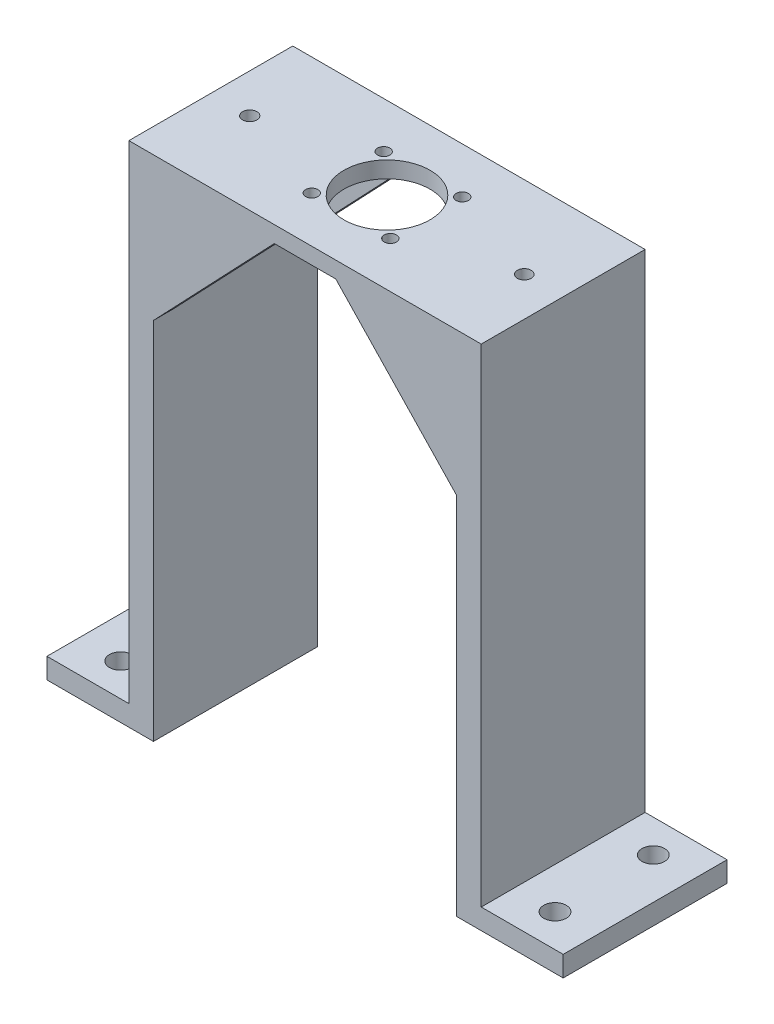
ISO-10303-21;
HEADER;
FILE_DESCRIPTION(('STEP AP214'),'2;1');
FILE_NAME('part.step','',(''),(''),'','','');
FILE_SCHEMA(('AUTOMOTIVE_DESIGN { 1 0 10303 214 1 1 1 1 }'));
ENDSEC;
DATA;
#1=APPLICATION_CONTEXT('core data for automotive mechanical design processes');
#2=APPLICATION_PROTOCOL_DEFINITION('international standard','automotive_design',2000,#1);
#3=PRODUCT_CONTEXT('',#1,'mechanical');
#4=PRODUCT('Part','Part','',(#3));
#5=PRODUCT_RELATED_PRODUCT_CATEGORY('part','',(#4));
#6=PRODUCT_DEFINITION_FORMATION('','',#4);
#7=PRODUCT_DEFINITION_CONTEXT('part definition',#1,'design');
#8=PRODUCT_DEFINITION('design','',#6,#7);
#9=PRODUCT_DEFINITION_SHAPE('','',#8);
#10=(LENGTH_UNIT() NAMED_UNIT(*) SI_UNIT(.MILLI.,.METRE.));
#11=(NAMED_UNIT(*) PLANE_ANGLE_UNIT() SI_UNIT($,.RADIAN.));
#12=(NAMED_UNIT(*) SI_UNIT($,.STERADIAN.) SOLID_ANGLE_UNIT());
#13=UNCERTAINTY_MEASURE_WITH_UNIT(LENGTH_MEASURE(1.E-05),#10,'distance_accuracy_value','');
#14=(GEOMETRIC_REPRESENTATION_CONTEXT(3) GLOBAL_UNCERTAINTY_ASSIGNED_CONTEXT((#13)) GLOBAL_UNIT_ASSIGNED_CONTEXT((#10,
#11,#12)) REPRESENTATION_CONTEXT('',''));
#15=CARTESIAN_POINT('',(0.,0.,0.));
#16=DIRECTION('',(0.,0.,1.));
#17=DIRECTION('',(1.,0.,0.));
#18=AXIS2_PLACEMENT_3D('',#15,#16,#17);
#19=CARTESIAN_POINT('',(0.,4.,0.));
#20=DIRECTION('',(0.,0.,-1.));
#21=DIRECTION('',(-1.,0.,0.));
#22=AXIS2_PLACEMENT_3D('',#19,#20,#21);
#23=PLANE('',#22);
#24=DIRECTION('',(0.689363360647643,-0.724415734917863,0.));
#25=VECTOR('',#24,1.);
#26=CARTESIAN_POINT('',(50.5,0.,0.));
#27=LINE('',#26,#25);
#28=CARTESIAN_POINT('',(50.5,0.,0.));
#29=VERTEX_POINT('',#28);
#30=CARTESIAN_POINT('',(80.,-31.,0.));
#31=VERTEX_POINT('',#30);
#32=EDGE_CURVE('E194',#29,#31,#27,.T.);
#33=ORIENTED_EDGE('',*,*,#32,.T.);
#34=DIRECTION('',(0.,1.,0.));
#35=VECTOR('',#34,1.);
#36=CARTESIAN_POINT('',(80.,-120.,0.));
#37=LINE('',#36,#35);
#38=CARTESIAN_POINT('',(80.,-120.,0.));
#39=VERTEX_POINT('',#38);
#40=EDGE_CURVE('E342',#39,#31,#37,.T.);
#41=ORIENTED_EDGE('',*,*,#40,.F.);
#42=DIRECTION('',(-1.,0.,0.));
#43=VECTOR('',#42,1.);
#44=CARTESIAN_POINT('',(86.,-120.,0.));
#45=LINE('',#44,#43);
#46=CARTESIAN_POINT('',(106.,-120.,0.));
#47=VERTEX_POINT('',#46);
#48=EDGE_CURVE('E335',#47,#39,#45,.T.);
#49=ORIENTED_EDGE('',*,*,#48,.F.);
#50=DIRECTION('',(0.,-1.,0.));
#51=VECTOR('',#50,1.);
#52=CARTESIAN_POINT('',(106.,-120.,0.));
#53=LINE('',#52,#51);
#54=CARTESIAN_POINT('',(106.,-115.,0.));
#55=VERTEX_POINT('',#54);
#56=EDGE_CURVE('E301',#55,#47,#53,.T.);
#57=ORIENTED_EDGE('',*,*,#56,.F.);
#58=DIRECTION('',(-1.,0.,0.));
#59=VECTOR('',#58,1.);
#60=CARTESIAN_POINT('',(106.,-115.,0.));
#61=LINE('',#60,#59);
#62=CARTESIAN_POINT('',(86.,-115.,0.));
#63=VERTEX_POINT('',#62);
#64=EDGE_CURVE('E311',#55,#63,#61,.T.);
#65=ORIENTED_EDGE('',*,*,#64,.T.);
#66=DIRECTION('',(0.,-1.,0.));
#67=VECTOR('',#66,1.);
#68=CARTESIAN_POINT('',(86.,4.,0.));
#69=LINE('',#68,#67);
#70=CARTESIAN_POINT('',(86.,4.,0.));
#71=VERTEX_POINT('',#70);
#72=EDGE_CURVE('E217',#71,#63,#69,.T.);
#73=ORIENTED_EDGE('',*,*,#72,.F.);
#74=DIRECTION('',(1.,0.,0.));
#75=VECTOR('',#74,1.);
#76=CARTESIAN_POINT('',(0.,4.,0.));
#77=LINE('',#76,#75);
#78=CARTESIAN_POINT('',(0.,4.,0.));
#79=VERTEX_POINT('',#78);
#80=EDGE_CURVE('E205',#79,#71,#77,.T.);
#81=ORIENTED_EDGE('',*,*,#80,.F.);
#82=DIRECTION('',(0.,-1.,0.));
#83=VECTOR('',#82,1.);
#84=CARTESIAN_POINT('',(0.,4.,0.));
#85=LINE('',#84,#83);
#86=CARTESIAN_POINT('',(0.,-115.,0.));
#87=VERTEX_POINT('',#86);
#88=EDGE_CURVE('E219',#79,#87,#85,.T.);
#89=ORIENTED_EDGE('',*,*,#88,.T.);
#90=DIRECTION('',(1.,0.,0.));
#91=VECTOR('',#90,1.);
#92=CARTESIAN_POINT('',(-20.,-115.,0.));
#93=LINE('',#92,#91);
#94=CARTESIAN_POINT('',(-20.,-115.,0.));
#95=VERTEX_POINT('',#94);
#96=EDGE_CURVE('E332',#95,#87,#93,.T.);
#97=ORIENTED_EDGE('',*,*,#96,.F.);
#98=DIRECTION('',(0.,1.,0.));
#99=VECTOR('',#98,1.);
#100=CARTESIAN_POINT('',(-20.,-120.,0.));
#101=LINE('',#100,#99);
#102=CARTESIAN_POINT('',(-20.,-120.,0.));
#103=VERTEX_POINT('',#102);
#104=EDGE_CURVE('E324',#103,#95,#101,.T.);
#105=ORIENTED_EDGE('',*,*,#104,.F.);
#106=DIRECTION('',(-1.,0.,0.));
#107=VECTOR('',#106,1.);
#108=CARTESIAN_POINT('',(0.,-120.,0.));
#109=LINE('',#108,#107);
#110=CARTESIAN_POINT('',(5.99999999999999,-120.,0.));
#111=VERTEX_POINT('',#110);
#112=EDGE_CURVE('E349',#111,#103,#109,.T.);
#113=ORIENTED_EDGE('',*,*,#112,.F.);
#114=DIRECTION('',(0.,1.,0.));
#115=VECTOR('',#114,1.);
#116=CARTESIAN_POINT('',(5.99999999999999,-120.,0.));
#117=LINE('',#116,#115);
#118=CARTESIAN_POINT('',(5.99999999999999,-31.,0.));
#119=VERTEX_POINT('',#118);
#120=EDGE_CURVE('E351',#111,#119,#117,.T.);
#121=ORIENTED_EDGE('',*,*,#120,.T.);
#122=DIRECTION('',(0.689363360647643,0.724415734917863,0.));
#123=VECTOR('',#122,1.);
#124=CARTESIAN_POINT('',(5.99999999999999,-31.,0.));
#125=LINE('',#124,#123);
#126=CARTESIAN_POINT('',(35.5,0.,0.));
#127=VERTEX_POINT('',#126);
#128=EDGE_CURVE('E400',#119,#127,#125,.T.);
#129=ORIENTED_EDGE('',*,*,#128,.T.);
#130=DIRECTION('',(1.,0.,0.));
#131=VECTOR('',#130,1.);
#132=CARTESIAN_POINT('',(0.,0.,0.));
#133=LINE('',#132,#131);
#134=EDGE_CURVE('E202',#127,#29,#133,.T.);
#135=ORIENTED_EDGE('',*,*,#134,.T.);
#136=EDGE_LOOP('',(#33,#41,#49,#57,#65,#73,#81,#89,#97,#105,#113,#121,#129,#135));
#137=FACE_BOUND('',#136,.T.);
#138=ADVANCED_FACE('F34',(#137),#23,.F.);
#139=CARTESIAN_POINT('',(0.,4.,-40.));
#140=DIRECTION('',(0.,0.,1.));
#141=DIRECTION('',(1.,0.,0.));
#142=AXIS2_PLACEMENT_3D('',#139,#140,#141);
#143=PLANE('',#142);
#144=DIRECTION('',(0.689363360647643,-0.724415734917863,0.));
#145=VECTOR('',#144,1.);
#146=CARTESIAN_POINT('',(50.5,0.,-40.));
#147=LINE('',#146,#145);
#148=CARTESIAN_POINT('',(50.5,0.,-40.));
#149=VERTEX_POINT('',#148);
#150=CARTESIAN_POINT('',(80.,-31.,-40.));
#151=VERTEX_POINT('',#150);
#152=EDGE_CURVE('E174',#149,#151,#147,.T.);
#153=ORIENTED_EDGE('',*,*,#152,.F.);
#154=DIRECTION('',(-1.,0.,0.));
#155=VECTOR('',#154,1.);
#156=CARTESIAN_POINT('',(0.,0.,-40.));
#157=LINE('',#156,#155);
#158=CARTESIAN_POINT('',(35.5,0.,-40.));
#159=VERTEX_POINT('',#158);
#160=EDGE_CURVE('E188',#149,#159,#157,.T.);
#161=ORIENTED_EDGE('',*,*,#160,.T.);
#162=DIRECTION('',(0.689363360647643,0.724415734917863,0.));
#163=VECTOR('',#162,1.);
#164=CARTESIAN_POINT('',(5.99999999999999,-31.,-40.));
#165=LINE('',#164,#163);
#166=CARTESIAN_POINT('',(5.99999999999999,-31.,-40.));
#167=VERTEX_POINT('',#166);
#168=EDGE_CURVE('E511',#167,#159,#165,.T.);
#169=ORIENTED_EDGE('',*,*,#168,.F.);
#170=DIRECTION('',(0.,1.,0.));
#171=VECTOR('',#170,1.);
#172=CARTESIAN_POINT('',(6.,-120.,-40.));
#173=LINE('',#172,#171);
#174=CARTESIAN_POINT('',(6.,-120.,-40.));
#175=VERTEX_POINT('',#174);
#176=EDGE_CURVE('E354',#175,#167,#173,.T.);
#177=ORIENTED_EDGE('',*,*,#176,.F.);
#178=DIRECTION('',(1.,0.,0.));
#179=VECTOR('',#178,1.);
#180=CARTESIAN_POINT('',(0.,-120.,-40.));
#181=LINE('',#180,#179);
#182=CARTESIAN_POINT('',(-20.,-120.,-40.));
#183=VERTEX_POINT('',#182);
#184=EDGE_CURVE('E345',#183,#175,#181,.T.);
#185=ORIENTED_EDGE('',*,*,#184,.F.);
#186=DIRECTION('',(0.,-1.,0.));
#187=VECTOR('',#186,1.);
#188=CARTESIAN_POINT('',(-20.,-120.,-40.));
#189=LINE('',#188,#187);
#190=CARTESIAN_POINT('',(-20.,-115.,-40.));
#191=VERTEX_POINT('',#190);
#192=EDGE_CURVE('E318',#191,#183,#189,.T.);
#193=ORIENTED_EDGE('',*,*,#192,.F.);
#194=DIRECTION('',(1.,0.,0.));
#195=VECTOR('',#194,1.);
#196=CARTESIAN_POINT('',(-20.,-115.,-40.));
#197=LINE('',#196,#195);
#198=CARTESIAN_POINT('',(0.,-115.,-40.));
#199=VERTEX_POINT('',#198);
#200=EDGE_CURVE('E328',#191,#199,#197,.T.);
#201=ORIENTED_EDGE('',*,*,#200,.T.);
#202=DIRECTION('',(0.,-1.,0.));
#203=VECTOR('',#202,1.);
#204=CARTESIAN_POINT('',(0.,4.,-40.));
#205=LINE('',#204,#203);
#206=CARTESIAN_POINT('',(0.,4.,-40.));
#207=VERTEX_POINT('',#206);
#208=EDGE_CURVE('E212',#207,#199,#205,.T.);
#209=ORIENTED_EDGE('',*,*,#208,.F.);
#210=DIRECTION('',(-1.,0.,0.));
#211=VECTOR('',#210,1.);
#212=CARTESIAN_POINT('',(0.,4.,-40.));
#213=LINE('',#212,#211);
#214=CARTESIAN_POINT('',(86.,4.,-40.));
#215=VERTEX_POINT('',#214);
#216=EDGE_CURVE('E215',#215,#207,#213,.T.);
#217=ORIENTED_EDGE('',*,*,#216,.F.);
#218=DIRECTION('',(0.,-1.,0.));
#219=VECTOR('',#218,1.);
#220=CARTESIAN_POINT('',(86.,4.,-40.));
#221=LINE('',#220,#219);
#222=CARTESIAN_POINT('',(86.,-115.,-40.));
#223=VERTEX_POINT('',#222);
#224=EDGE_CURVE('E214',#215,#223,#221,.T.);
#225=ORIENTED_EDGE('',*,*,#224,.T.);
#226=DIRECTION('',(-1.,0.,0.));
#227=VECTOR('',#226,1.);
#228=CARTESIAN_POINT('',(106.,-115.,-40.));
#229=LINE('',#228,#227);
#230=CARTESIAN_POINT('',(106.,-115.,-40.));
#231=VERTEX_POINT('',#230);
#232=EDGE_CURVE('E315',#231,#223,#229,.T.);
#233=ORIENTED_EDGE('',*,*,#232,.F.);
#234=DIRECTION('',(0.,1.,0.));
#235=VECTOR('',#234,1.);
#236=CARTESIAN_POINT('',(106.,-120.,-40.));
#237=LINE('',#236,#235);
#238=CARTESIAN_POINT('',(106.,-120.,-40.));
#239=VERTEX_POINT('',#238);
#240=EDGE_CURVE('E307',#239,#231,#237,.T.);
#241=ORIENTED_EDGE('',*,*,#240,.F.);
#242=DIRECTION('',(1.,0.,0.));
#243=VECTOR('',#242,1.);
#244=CARTESIAN_POINT('',(86.,-120.,-40.));
#245=LINE('',#244,#243);
#246=CARTESIAN_POINT('',(80.,-120.,-40.));
#247=VERTEX_POINT('',#246);
#248=EDGE_CURVE('E339',#247,#239,#245,.T.);
#249=ORIENTED_EDGE('',*,*,#248,.F.);
#250=DIRECTION('',(0.,1.,0.));
#251=VECTOR('',#250,1.);
#252=CARTESIAN_POINT('',(80.,-120.,-40.));
#253=LINE('',#252,#251);
#254=EDGE_CURVE('E192',#247,#151,#253,.T.);
#255=ORIENTED_EDGE('',*,*,#254,.T.);
#256=EDGE_LOOP('',(#153,#161,#169,#177,#185,#193,#201,#209,#217,#225,#233,#241,#249,#255));
#257=FACE_BOUND('',#256,.T.);
#258=ADVANCED_FACE('F186',(#257),#143,.F.);
#259=CARTESIAN_POINT('',(5.99999999999999,0.,-5.));
#260=DIRECTION('',(0.,0.,1.));
#261=DIRECTION('',(0.,-1.,0.));
#262=AXIS2_PLACEMENT_3D('',#259,#260,#261);
#263=PLANE('',#262);
#264=DIRECTION('',(0.689363360647643,0.724415734917863,0.));
#265=VECTOR('',#264,1.);
#266=CARTESIAN_POINT('',(21.4809556313993,-14.7318771331058,-5.));
#267=LINE('',#266,#265);
#268=CARTESIAN_POINT('',(5.99999999999999,-31.,-5.00000000000001));
#269=VERTEX_POINT('',#268);
#270=CARTESIAN_POINT('',(35.5,0.,-5.));
#271=VERTEX_POINT('',#270);
#272=EDGE_CURVE('E399',#269,#271,#267,.T.);
#273=ORIENTED_EDGE('',*,*,#272,.F.);
#274=DIRECTION('',(0.,-1.,0.));
#275=VECTOR('',#274,1.);
#276=CARTESIAN_POINT('',(5.99999999999999,0.,-5.));
#277=LINE('',#276,#275);
#278=CARTESIAN_POINT('',(5.99999999999999,0.,-5.));
#279=VERTEX_POINT('',#278);
#280=EDGE_CURVE('E233',#279,#269,#277,.T.);
#281=ORIENTED_EDGE('',*,*,#280,.F.);
#282=DIRECTION('',(1.,0.,0.));
#283=VECTOR('',#282,1.);
#284=CARTESIAN_POINT('',(5.99999999999999,0.,-5.));
#285=LINE('',#284,#283);
#286=EDGE_CURVE('E225',#279,#271,#285,.T.);
#287=ORIENTED_EDGE('',*,*,#286,.T.);
#288=EDGE_LOOP('',(#273,#281,#287));
#289=FACE_BOUND('',#288,.T.);
#290=ADVANCED_FACE('F402',(#289),#263,.F.);
#291=CARTESIAN_POINT('',(6.,0.,-35.));
#292=DIRECTION('',(0.,0.,-1.));
#293=DIRECTION('',(0.,1.,0.));
#294=AXIS2_PLACEMENT_3D('',#291,#292,#293);
#295=PLANE('',#294);
#296=DIRECTION('',(-0.689363360647643,-0.724415734917863,0.));
#297=VECTOR('',#296,1.);
#298=CARTESIAN_POINT('',(21.4809556313993,-14.7318771331058,-35.));
#299=LINE('',#298,#297);
#300=CARTESIAN_POINT('',(35.5,0.,-35.));
#301=VERTEX_POINT('',#300);
#302=CARTESIAN_POINT('',(5.99999999999999,-31.,-35.));
#303=VERTEX_POINT('',#302);
#304=EDGE_CURVE('E11',#301,#303,#299,.T.);
#305=ORIENTED_EDGE('',*,*,#304,.F.);
#306=DIRECTION('',(1.,0.,0.));
#307=VECTOR('',#306,1.);
#308=CARTESIAN_POINT('',(6.,0.,-35.));
#309=LINE('',#308,#307);
#310=CARTESIAN_POINT('',(6.,0.,-35.));
#311=VERTEX_POINT('',#310);
#312=EDGE_CURVE('E252',#311,#301,#309,.T.);
#313=ORIENTED_EDGE('',*,*,#312,.F.);
#314=DIRECTION('',(0.,1.,0.));
#315=VECTOR('',#314,1.);
#316=CARTESIAN_POINT('',(6.,0.,-35.));
#317=LINE('',#316,#315);
#318=EDGE_CURVE('E246',#303,#311,#317,.T.);
#319=ORIENTED_EDGE('',*,*,#318,.F.);
#320=EDGE_LOOP('',(#305,#313,#319));
#321=FACE_BOUND('',#320,.T.);
#322=ADVANCED_FACE('F425',(#321),#295,.F.);
#323=CARTESIAN_POINT('',(80.,-31.,-5.));
#324=DIRECTION('',(0.,0.,1.));
#325=DIRECTION('',(0.,-1.,0.));
#326=AXIS2_PLACEMENT_3D('',#323,#324,#325);
#327=PLANE('',#326);
#328=DIRECTION('',(0.689363360647643,-0.724415734917863,0.));
#329=VECTOR('',#328,1.);
#330=CARTESIAN_POINT('',(80.,-31.,-5.));
#331=LINE('',#330,#329);
#332=CARTESIAN_POINT('',(50.5,0.,-5.));
#333=VERTEX_POINT('',#332);
#334=CARTESIAN_POINT('',(80.,-31.,-5.));
#335=VERTEX_POINT('',#334);
#336=EDGE_CURVE('E193',#333,#335,#331,.T.);
#337=ORIENTED_EDGE('',*,*,#336,.F.);
#338=DIRECTION('',(-1.,0.,0.));
#339=VECTOR('',#338,1.);
#340=CARTESIAN_POINT('',(80.,0.,-5.));
#341=LINE('',#340,#339);
#342=CARTESIAN_POINT('',(80.,0.,-5.));
#343=VERTEX_POINT('',#342);
#344=EDGE_CURVE('E235',#343,#333,#341,.T.);
#345=ORIENTED_EDGE('',*,*,#344,.F.);
#346=DIRECTION('',(0.,1.,0.));
#347=VECTOR('',#346,1.);
#348=CARTESIAN_POINT('',(80.,-31.,-5.));
#349=LINE('',#348,#347);
#350=EDGE_CURVE('E404',#335,#343,#349,.T.);
#351=ORIENTED_EDGE('',*,*,#350,.F.);
#352=EDGE_LOOP('',(#337,#345,#351));
#353=FACE_BOUND('',#352,.T.);
#354=ADVANCED_FACE('F418',(#353),#327,.F.);
#355=CARTESIAN_POINT('',(80.,-31.,-35.));
#356=DIRECTION('',(0.,0.,-1.));
#357=DIRECTION('',(-1.,0.,0.));
#358=AXIS2_PLACEMENT_3D('',#355,#356,#357);
#359=PLANE('',#358);
#360=DIRECTION('',(-0.689363360647643,0.724415734917863,0.));
#361=VECTOR('',#360,1.);
#362=CARTESIAN_POINT('',(80.,-31.,-35.));
#363=LINE('',#362,#361);
#364=CARTESIAN_POINT('',(80.,-31.,-35.));
#365=VERTEX_POINT('',#364);
#366=CARTESIAN_POINT('',(50.5,0.,-35.));
#367=VERTEX_POINT('',#366);
#368=EDGE_CURVE('E42',#365,#367,#363,.T.);
#369=ORIENTED_EDGE('',*,*,#368,.F.);
#370=DIRECTION('',(0.,-1.,0.));
#371=VECTOR('',#370,1.);
#372=CARTESIAN_POINT('',(80.,-31.,-35.));
#373=LINE('',#372,#371);
#374=CARTESIAN_POINT('',(80.,0.,-35.));
#375=VERTEX_POINT('',#374);
#376=EDGE_CURVE('E239',#375,#365,#373,.T.);
#377=ORIENTED_EDGE('',*,*,#376,.F.);
#378=DIRECTION('',(-1.,0.,0.));
#379=VECTOR('',#378,1.);
#380=CARTESIAN_POINT('',(80.,0.,-35.));
#381=LINE('',#380,#379);
#382=EDGE_CURVE('E229',#375,#367,#381,.T.);
#383=ORIENTED_EDGE('',*,*,#382,.T.);
#384=EDGE_LOOP('',(#369,#377,#383));
#385=FACE_BOUND('',#384,.T.);
#386=ADVANCED_FACE('F416',(#385),#359,.F.);
#387=CARTESIAN_POINT('',(80.,-120.,0.));
#388=DIRECTION('',(1.,0.,0.));
#389=DIRECTION('',(0.,0.,-1.));
#390=AXIS2_PLACEMENT_3D('',#387,#388,#389);
#391=PLANE('',#390);
#392=ORIENTED_EDGE('',*,*,#376,.T.);
#393=DIRECTION('',(0.,0.,1.));
#394=VECTOR('',#393,1.);
#395=CARTESIAN_POINT('',(80.,-31.,-40.));
#396=LINE('',#395,#394);
#397=EDGE_CURVE('E181',#151,#365,#396,.T.);
#398=ORIENTED_EDGE('',*,*,#397,.F.);
#399=ORIENTED_EDGE('',*,*,#254,.F.);
#400=DIRECTION('',(0.,0.,-1.));
#401=VECTOR('',#400,1.);
#402=CARTESIAN_POINT('',(80.,-120.,0.));
#403=LINE('',#402,#401);
#404=EDGE_CURVE('E337',#39,#247,#403,.T.);
#405=ORIENTED_EDGE('',*,*,#404,.F.);
#406=ORIENTED_EDGE('',*,*,#40,.T.);
#407=EDGE_CURVE('E269',#335,#31,#396,.T.);
#408=ORIENTED_EDGE('',*,*,#407,.F.);
#409=ORIENTED_EDGE('',*,*,#350,.T.);
#410=DIRECTION('',(0.,0.,-1.));
#411=VECTOR('',#410,1.);
#412=CARTESIAN_POINT('',(80.,0.,-5.));
#413=LINE('',#412,#411);
#414=EDGE_CURVE('E407',#343,#375,#413,.T.);
#415=ORIENTED_EDGE('',*,*,#414,.T.);
#416=EDGE_LOOP('',(#392,#398,#399,#405,#406,#408,#409,#415));
#417=FACE_BOUND('',#416,.T.);
#418=ADVANCED_FACE('F415',(#417),#391,.F.);
#419=CARTESIAN_POINT('',(0.,0.,0.));
#420=DIRECTION('',(0.,-1.,0.));
#421=DIRECTION('',(0.,0.,-1.));
#422=AXIS2_PLACEMENT_3D('',#419,#420,#421);
#423=PLANE('',#422);
#424=CARTESIAN_POINT('',(9.49999999999999,0.,-20.));
#425=DIRECTION('',(0.,-1.,0.));
#426=DIRECTION('',(0.,0.,-1.));
#427=AXIS2_PLACEMENT_3D('',#424,#425,#426);
#428=CIRCLE('',#427,1.75);
#429=CARTESIAN_POINT('',(9.49999999999999,0.,-21.75));
#430=VERTEX_POINT('',#429);
#431=EDGE_CURVE('E512',#430,#430,#428,.T.);
#432=ORIENTED_EDGE('',*,*,#431,.F.);
#433=EDGE_LOOP('',(#432));
#434=FACE_BOUND('',#433,.T.);
#435=CARTESIAN_POINT('',(76.5,0.,-20.));
#436=DIRECTION('',(0.,-1.,0.));
#437=DIRECTION('',(0.,0.,-1.));
#438=AXIS2_PLACEMENT_3D('',#435,#436,#437);
#439=CIRCLE('',#438,1.7);
#440=CARTESIAN_POINT('',(76.5,0.,-21.7));
#441=VERTEX_POINT('',#440);
#442=EDGE_CURVE('E515',#441,#441,#439,.T.);
#443=ORIENTED_EDGE('',*,*,#442,.F.);
#444=EDGE_LOOP('',(#443));
#445=FACE_BOUND('',#444,.T.);
#446=CARTESIAN_POINT('',(43.,0.,-20.));
#447=DIRECTION('',(0.,1.,0.));
#448=DIRECTION('',(0.,0.,1.));
#449=AXIS2_PLACEMENT_3D('',#446,#447,#448);
#450=CIRCLE('',#449,10.5);
#451=CARTESIAN_POINT('',(43.,0.,-9.5));
#452=VERTEX_POINT('',#451);
#453=EDGE_CURVE('E208',#452,#452,#450,.T.);
#454=ORIENTED_EDGE('',*,*,#453,.T.);
#455=EDGE_LOOP('',(#454));
#456=FACE_BOUND('',#455,.T.);
#457=ORIENTED_EDGE('',*,*,#344,.T.);
#458=DIRECTION('',(0.,0.,-1.));
#459=VECTOR('',#458,1.);
#460=CARTESIAN_POINT('',(50.5,0.,-40.));
#461=LINE('',#460,#459);
#462=EDGE_CURVE('E180',#29,#333,#461,.T.);
#463=ORIENTED_EDGE('',*,*,#462,.F.);
#464=ORIENTED_EDGE('',*,*,#134,.F.);
#465=DIRECTION('',(0.,0.,1.));
#466=VECTOR('',#465,1.);
#467=CARTESIAN_POINT('',(35.5,0.,-40.));
#468=LINE('',#467,#466);
#469=EDGE_CURVE('E275',#271,#127,#468,.T.);
#470=ORIENTED_EDGE('',*,*,#469,.F.);
#471=ORIENTED_EDGE('',*,*,#286,.F.);
#472=DIRECTION('',(0.,0.,1.));
#473=VECTOR('',#472,1.);
#474=CARTESIAN_POINT('',(5.99999999999999,0.,-5.));
#475=LINE('',#474,#473);
#476=EDGE_CURVE('E249',#311,#279,#475,.T.);
#477=ORIENTED_EDGE('',*,*,#476,.F.);
#478=ORIENTED_EDGE('',*,*,#312,.T.);
#479=EDGE_CURVE('E200',#159,#301,#468,.T.);
#480=ORIENTED_EDGE('',*,*,#479,.F.);
#481=ORIENTED_EDGE('',*,*,#160,.F.);
#482=EDGE_CURVE('E171',#367,#149,#461,.T.);
#483=ORIENTED_EDGE('',*,*,#482,.F.);
#484=ORIENTED_EDGE('',*,*,#382,.F.);
#485=ORIENTED_EDGE('',*,*,#414,.F.);
#486=EDGE_LOOP('',(#457,#463,#464,#470,#471,#477,#478,#480,#481,#483,#484,#485));
#487=FACE_BOUND('',#486,.T.);
#488=CARTESIAN_POINT('',(33.4101520063843,0.,-11.2230520418915));
#489=DIRECTION('',(0.,1.,0.));
#490=DIRECTION('',(-1.,0.,0.));
#491=AXIS2_PLACEMENT_3D('',#488,#489,#490);
#492=CIRCLE('',#491,1.5);
#493=CARTESIAN_POINT('',(31.9101520063843,0.,-11.2230520418915));
#494=VERTEX_POINT('',#493);
#495=EDGE_CURVE('E221',#494,#494,#492,.F.);
#496=ORIENTED_EDGE('',*,*,#495,.F.);
#497=EDGE_LOOP('',(#496));
#498=FACE_BOUND('',#497,.T.);
#499=CARTESIAN_POINT('',(33.4101520063843,0.,-28.7769479581085));
#500=DIRECTION('',(0.,1.,0.));
#501=DIRECTION('',(-1.,0.,0.));
#502=AXIS2_PLACEMENT_3D('',#499,#500,#501);
#503=CIRCLE('',#502,1.5);
#504=CARTESIAN_POINT('',(31.9101520063843,0.,-28.7769479581085));
#505=VERTEX_POINT('',#504);
#506=EDGE_CURVE('E224',#505,#505,#503,.F.);
#507=ORIENTED_EDGE('',*,*,#506,.F.);
#508=EDGE_LOOP('',(#507));
#509=FACE_BOUND('',#508,.T.);
#510=CARTESIAN_POINT('',(52.5898479936157,0.,-11.2230520418915));
#511=DIRECTION('',(0.,1.,0.));
#512=DIRECTION('',(0.,0.,1.));
#513=AXIS2_PLACEMENT_3D('',#510,#511,#512);
#514=CIRCLE('',#513,1.5);
#515=CARTESIAN_POINT('',(52.5898479936157,0.,-9.72305204189149));
#516=VERTEX_POINT('',#515);
#517=EDGE_CURVE('E228',#516,#516,#514,.F.);
#518=ORIENTED_EDGE('',*,*,#517,.F.);
#519=EDGE_LOOP('',(#518));
#520=FACE_BOUND('',#519,.T.);
#521=CARTESIAN_POINT('',(52.5898479936157,0.,-28.7769479581085));
#522=DIRECTION('',(0.,1.,0.));
#523=DIRECTION('',(0.,0.,1.));
#524=AXIS2_PLACEMENT_3D('',#521,#522,#523);
#525=CIRCLE('',#524,1.5);
#526=CARTESIAN_POINT('',(52.5898479936157,0.,-27.2769479581085));
#527=VERTEX_POINT('',#526);
#528=EDGE_CURVE('E226',#527,#527,#525,.F.);
#529=ORIENTED_EDGE('',*,*,#528,.F.);
#530=EDGE_LOOP('',(#529));
#531=FACE_BOUND('',#530,.T.);
#532=ADVANCED_FACE('F197',(#434,#445,#456,#487,#498,#509,#520,#531),#423,.T.);
#533=CARTESIAN_POINT('',(6.,-120.,-40.));
#534=DIRECTION('',(-1.,0.,0.));
#535=DIRECTION('',(0.,0.,1.));
#536=AXIS2_PLACEMENT_3D('',#533,#534,#535);
#537=PLANE('',#536);
#538=DIRECTION('',(0.,0.,-1.));
#539=VECTOR('',#538,1.);
#540=CARTESIAN_POINT('',(6.,-31.,-40.));
#541=LINE('',#540,#539);
#542=EDGE_CURVE('E271',#303,#167,#541,.T.);
#543=ORIENTED_EDGE('',*,*,#542,.F.);
#544=ORIENTED_EDGE('',*,*,#318,.T.);
#545=ORIENTED_EDGE('',*,*,#476,.T.);
#546=ORIENTED_EDGE('',*,*,#280,.T.);
#547=EDGE_CURVE('E276',#119,#269,#541,.T.);
#548=ORIENTED_EDGE('',*,*,#547,.F.);
#549=ORIENTED_EDGE('',*,*,#120,.F.);
#550=DIRECTION('',(0.,0.,1.));
#551=VECTOR('',#550,1.);
#552=CARTESIAN_POINT('',(6.,-120.,-40.));
#553=LINE('',#552,#551);
#554=EDGE_CURVE('E347',#175,#111,#553,.T.);
#555=ORIENTED_EDGE('',*,*,#554,.F.);
#556=ORIENTED_EDGE('',*,*,#176,.T.);
#557=EDGE_LOOP('',(#543,#544,#545,#546,#548,#549,#555,#556));
#558=FACE_BOUND('',#557,.T.);
#559=ADVANCED_FACE('F394',(#558),#537,.F.);
#560=CARTESIAN_POINT('',(-20.,-115.,-40.));
#561=DIRECTION('',(0.,-1.,0.));
#562=DIRECTION('',(0.,0.,-1.));
#563=AXIS2_PLACEMENT_3D('',#560,#561,#562);
#564=PLANE('',#563);
#565=DIRECTION('',(0.,0.,-1.));
#566=VECTOR('',#565,1.);
#567=CARTESIAN_POINT('',(0.,-115.,-40.));
#568=LINE('',#567,#566);
#569=EDGE_CURVE('E57',#87,#199,#568,.T.);
#570=ORIENTED_EDGE('',*,*,#569,.T.);
#571=ORIENTED_EDGE('',*,*,#200,.F.);
#572=DIRECTION('',(0.,0.,-1.));
#573=VECTOR('',#572,1.);
#574=CARTESIAN_POINT('',(-20.,-115.,-40.));
#575=LINE('',#574,#573);
#576=EDGE_CURVE('E326',#95,#191,#575,.T.);
#577=ORIENTED_EDGE('',*,*,#576,.F.);
#578=ORIENTED_EDGE('',*,*,#96,.T.);
#579=EDGE_LOOP('',(#570,#571,#577,#578));
#580=FACE_BOUND('',#579,.T.);
#581=CARTESIAN_POINT('',(-10.,-115.,-8.00000000000002));
#582=DIRECTION('',(0.,1.,0.));
#583=DIRECTION('',(0.,0.,1.));
#584=AXIS2_PLACEMENT_3D('',#581,#582,#583);
#585=CIRCLE('',#584,2.75);
#586=CARTESIAN_POINT('',(-10.,-115.,-5.25000000000003));
#587=VERTEX_POINT('',#586);
#588=EDGE_CURVE('E283',#587,#587,#585,.T.);
#589=ORIENTED_EDGE('',*,*,#588,.F.);
#590=EDGE_LOOP('',(#589));
#591=FACE_BOUND('',#590,.T.);
#592=CARTESIAN_POINT('',(-10.,-115.,-32.));
#593=DIRECTION('',(0.,1.,0.));
#594=DIRECTION('',(0.,0.,1.));
#595=AXIS2_PLACEMENT_3D('',#592,#593,#594);
#596=CIRCLE('',#595,2.75);
#597=CARTESIAN_POINT('',(-10.,-115.,-29.25));
#598=VERTEX_POINT('',#597);
#599=EDGE_CURVE('E274',#598,#598,#596,.T.);
#600=ORIENTED_EDGE('',*,*,#599,.F.);
#601=EDGE_LOOP('',(#600));
#602=FACE_BOUND('',#601,.T.);
#603=ADVANCED_FACE('F379',(#580,#591,#602),#564,.F.);
#604=CARTESIAN_POINT('',(106.,-115.,0.));
#605=DIRECTION('',(0.,-1.,0.));
#606=DIRECTION('',(0.,0.,-1.));
#607=AXIS2_PLACEMENT_3D('',#604,#605,#606);
#608=PLANE('',#607);
#609=CARTESIAN_POINT('',(96.,-115.,-32.));
#610=DIRECTION('',(0.,1.,0.));
#611=DIRECTION('',(0.,0.,1.));
#612=AXIS2_PLACEMENT_3D('',#609,#610,#611);
#613=CIRCLE('',#612,2.75);
#614=CARTESIAN_POINT('',(96.,-115.,-29.25));
#615=VERTEX_POINT('',#614);
#616=EDGE_CURVE('E289',#615,#615,#613,.T.);
#617=ORIENTED_EDGE('',*,*,#616,.F.);
#618=EDGE_LOOP('',(#617));
#619=FACE_BOUND('',#618,.T.);
#620=DIRECTION('',(0.,0.,1.));
#621=VECTOR('',#620,1.);
#622=CARTESIAN_POINT('',(86.,-115.,0.));
#623=LINE('',#622,#621);
#624=EDGE_CURVE('E49',#223,#63,#623,.T.);
#625=ORIENTED_EDGE('',*,*,#624,.T.);
#626=ORIENTED_EDGE('',*,*,#64,.F.);
#627=DIRECTION('',(0.,0.,1.));
#628=VECTOR('',#627,1.);
#629=CARTESIAN_POINT('',(106.,-115.,0.));
#630=LINE('',#629,#628);
#631=EDGE_CURVE('E309',#231,#55,#630,.T.);
#632=ORIENTED_EDGE('',*,*,#631,.F.);
#633=ORIENTED_EDGE('',*,*,#232,.T.);
#634=EDGE_LOOP('',(#625,#626,#632,#633));
#635=FACE_BOUND('',#634,.T.);
#636=CARTESIAN_POINT('',(96.,-115.,-8.));
#637=DIRECTION('',(0.,1.,0.));
#638=DIRECTION('',(0.,0.,1.));
#639=AXIS2_PLACEMENT_3D('',#636,#637,#638);
#640=CIRCLE('',#639,2.75);
#641=CARTESIAN_POINT('',(96.,-115.,-5.25));
#642=VERTEX_POINT('',#641);
#643=EDGE_CURVE('E295',#642,#642,#640,.T.);
#644=ORIENTED_EDGE('',*,*,#643,.F.);
#645=EDGE_LOOP('',(#644));
#646=FACE_BOUND('',#645,.T.);
#647=ADVANCED_FACE('F437',(#619,#635,#646),#608,.F.);
#648=CARTESIAN_POINT('',(86.,4.,0.));
#649=DIRECTION('',(-1.,0.,0.));
#650=DIRECTION('',(0.,0.,1.));
#651=AXIS2_PLACEMENT_3D('',#648,#649,#650);
#652=PLANE('',#651);
#653=ORIENTED_EDGE('',*,*,#624,.F.);
#654=ORIENTED_EDGE('',*,*,#224,.F.);
#655=DIRECTION('',(0.,0.,-1.));
#656=VECTOR('',#655,1.);
#657=CARTESIAN_POINT('',(86.,4.,0.));
#658=LINE('',#657,#656);
#659=EDGE_CURVE('E363',#71,#215,#658,.T.);
#660=ORIENTED_EDGE('',*,*,#659,.F.);
#661=ORIENTED_EDGE('',*,*,#72,.T.);
#662=EDGE_LOOP('',(#653,#654,#660,#661));
#663=FACE_BOUND('',#662,.T.);
#664=ADVANCED_FACE('F435',(#663),#652,.F.);
#665=CARTESIAN_POINT('',(0.,4.,0.));
#666=DIRECTION('',(1.,0.,0.));
#667=DIRECTION('',(0.,0.,-1.));
#668=AXIS2_PLACEMENT_3D('',#665,#666,#667);
#669=PLANE('',#668);
#670=ORIENTED_EDGE('',*,*,#569,.F.);
#671=ORIENTED_EDGE('',*,*,#88,.F.);
#672=DIRECTION('',(0.,0.,1.));
#673=VECTOR('',#672,1.);
#674=CARTESIAN_POINT('',(0.,4.,0.));
#675=LINE('',#674,#673);
#676=EDGE_CURVE('E201',#207,#79,#675,.T.);
#677=ORIENTED_EDGE('',*,*,#676,.F.);
#678=ORIENTED_EDGE('',*,*,#208,.T.);
#679=EDGE_LOOP('',(#670,#671,#677,#678));
#680=FACE_BOUND('',#679,.T.);
#681=ADVANCED_FACE('F36',(#680),#669,.F.);
#682=CARTESIAN_POINT('',(0.,4.,0.));
#683=DIRECTION('',(0.,-1.,0.));
#684=DIRECTION('',(0.,0.,-1.));
#685=AXIS2_PLACEMENT_3D('',#682,#683,#684);
#686=PLANE('',#685);
#687=CARTESIAN_POINT('',(9.49999999999999,4.,-20.));
#688=DIRECTION('',(0.,1.,0.));
#689=DIRECTION('',(0.,0.,1.));
#690=AXIS2_PLACEMENT_3D('',#687,#688,#689);
#691=CIRCLE('',#690,1.75);
#692=CARTESIAN_POINT('',(9.49999999999999,4.,-18.25));
#693=VERTEX_POINT('',#692);
#694=EDGE_CURVE('E521',#693,#693,#691,.T.);
#695=ORIENTED_EDGE('',*,*,#694,.F.);
#696=EDGE_LOOP('',(#695));
#697=FACE_BOUND('',#696,.T.);
#698=CARTESIAN_POINT('',(76.5,4.,-20.));
#699=DIRECTION('',(0.,1.,0.));
#700=DIRECTION('',(0.,0.,1.));
#701=AXIS2_PLACEMENT_3D('',#698,#699,#700);
#702=CIRCLE('',#701,1.7);
#703=CARTESIAN_POINT('',(76.5,4.,-18.3));
#704=VERTEX_POINT('',#703);
#705=EDGE_CURVE('E522',#704,#704,#702,.T.);
#706=ORIENTED_EDGE('',*,*,#705,.F.);
#707=EDGE_LOOP('',(#706));
#708=FACE_BOUND('',#707,.T.);
#709=CARTESIAN_POINT('',(52.5898479936157,4.,-28.7769479581085));
#710=DIRECTION('',(0.,1.,0.));
#711=DIRECTION('',(0.,0.,1.));
#712=AXIS2_PLACEMENT_3D('',#709,#710,#711);
#713=CIRCLE('',#712,1.5);
#714=CARTESIAN_POINT('',(52.5898479936157,4.,-27.2769479581085));
#715=VERTEX_POINT('',#714);
#716=EDGE_CURVE('E258',#715,#715,#713,.T.);
#717=ORIENTED_EDGE('',*,*,#716,.F.);
#718=EDGE_LOOP('',(#717));
#719=FACE_BOUND('',#718,.T.);
#720=CARTESIAN_POINT('',(52.5898479936157,4.,-11.2230520418915));
#721=DIRECTION('',(0.,1.,0.));
#722=DIRECTION('',(0.,0.,1.));
#723=AXIS2_PLACEMENT_3D('',#720,#721,#722);
#724=CIRCLE('',#723,1.5);
#725=CARTESIAN_POINT('',(52.5898479936157,4.,-9.72305204189149));
#726=VERTEX_POINT('',#725);
#727=EDGE_CURVE('E263',#726,#726,#724,.T.);
#728=ORIENTED_EDGE('',*,*,#727,.F.);
#729=EDGE_LOOP('',(#728));
#730=FACE_BOUND('',#729,.T.);
#731=CARTESIAN_POINT('',(33.4101520063843,4.,-11.2230520418915));
#732=DIRECTION('',(0.,1.,0.));
#733=DIRECTION('',(0.,0.,1.));
#734=AXIS2_PLACEMENT_3D('',#731,#732,#733);
#735=CIRCLE('',#734,1.5);
#736=CARTESIAN_POINT('',(33.4101520063843,4.,-9.72305204189149));
#737=VERTEX_POINT('',#736);
#738=EDGE_CURVE('E259',#737,#737,#735,.T.);
#739=ORIENTED_EDGE('',*,*,#738,.F.);
#740=EDGE_LOOP('',(#739));
#741=FACE_BOUND('',#740,.T.);
#742=CARTESIAN_POINT('',(33.4101520063843,4.,-28.7769479581085));
#743=DIRECTION('',(0.,1.,0.));
#744=DIRECTION('',(0.,0.,1.));
#745=AXIS2_PLACEMENT_3D('',#742,#743,#744);
#746=CIRCLE('',#745,1.5);
#747=CARTESIAN_POINT('',(33.4101520063843,4.,-27.2769479581085));
#748=VERTEX_POINT('',#747);
#749=EDGE_CURVE('E262',#748,#748,#746,.T.);
#750=ORIENTED_EDGE('',*,*,#749,.F.);
#751=EDGE_LOOP('',(#750));
#752=FACE_BOUND('',#751,.T.);
#753=CARTESIAN_POINT('',(43.,4.,-20.));
#754=DIRECTION('',(0.,1.,0.));
#755=DIRECTION('',(0.,0.,1.));
#756=AXIS2_PLACEMENT_3D('',#753,#754,#755);
#757=CIRCLE('',#756,10.5);
#758=CARTESIAN_POINT('',(43.,4.,-9.5));
#759=VERTEX_POINT('',#758);
#760=EDGE_CURVE('E357',#759,#759,#757,.T.);
#761=ORIENTED_EDGE('',*,*,#760,.F.);
#762=EDGE_LOOP('',(#761));
#763=FACE_BOUND('',#762,.T.);
#764=ORIENTED_EDGE('',*,*,#676,.T.);
#765=ORIENTED_EDGE('',*,*,#80,.T.);
#766=ORIENTED_EDGE('',*,*,#659,.T.);
#767=ORIENTED_EDGE('',*,*,#216,.T.);
#768=EDGE_LOOP('',(#764,#765,#766,#767));
#769=FACE_BOUND('',#768,.T.);
#770=ADVANCED_FACE('F367',(#697,#708,#719,#730,#741,#752,#763,#769),#686,.F.);
#771=CARTESIAN_POINT('',(43.,0.,-20.));
#772=DIRECTION('',(0.,1.,0.));
#773=DIRECTION('',(0.,0.,1.));
#774=AXIS2_PLACEMENT_3D('',#771,#772,#773);
#775=CYLINDRICAL_SURFACE('',#774,10.5);
#776=ORIENTED_EDGE('',*,*,#453,.F.);
#777=EDGE_LOOP('',(#776));
#778=FACE_BOUND('',#777,.T.);
#779=ORIENTED_EDGE('',*,*,#760,.T.);
#780=EDGE_LOOP('',(#779));
#781=FACE_BOUND('',#780,.T.);
#782=ADVANCED_FACE('F444',(#778,#781),#775,.F.);
#783=CARTESIAN_POINT('',(0.,-120.,0.));
#784=DIRECTION('',(0.,1.,0.));
#785=DIRECTION('',(0.,0.,1.));
#786=AXIS2_PLACEMENT_3D('',#783,#784,#785);
#787=PLANE('',#786);
#788=CARTESIAN_POINT('',(-10.,-120.,-32.));
#789=DIRECTION('',(0.,1.,0.));
#790=DIRECTION('',(0.,0.,1.));
#791=AXIS2_PLACEMENT_3D('',#788,#789,#790);
#792=CIRCLE('',#791,2.75);
#793=CARTESIAN_POINT('',(-10.,-120.,-29.25));
#794=VERTEX_POINT('',#793);
#795=EDGE_CURVE('E280',#794,#794,#792,.T.);
#796=ORIENTED_EDGE('',*,*,#795,.T.);
#797=EDGE_LOOP('',(#796));
#798=FACE_BOUND('',#797,.T.);
#799=CARTESIAN_POINT('',(-10.,-120.,-8.00000000000002));
#800=DIRECTION('',(0.,1.,0.));
#801=DIRECTION('',(0.,0.,1.));
#802=AXIS2_PLACEMENT_3D('',#799,#800,#801);
#803=CIRCLE('',#802,2.75);
#804=CARTESIAN_POINT('',(-10.,-120.,-5.25000000000002));
#805=VERTEX_POINT('',#804);
#806=EDGE_CURVE('E286',#805,#805,#803,.T.);
#807=ORIENTED_EDGE('',*,*,#806,.T.);
#808=EDGE_LOOP('',(#807));
#809=FACE_BOUND('',#808,.T.);
#810=ORIENTED_EDGE('',*,*,#112,.T.);
#811=DIRECTION('',(0.,0.,1.));
#812=VECTOR('',#811,1.);
#813=CARTESIAN_POINT('',(-20.,-120.,-40.));
#814=LINE('',#813,#812);
#815=EDGE_CURVE('E321',#183,#103,#814,.T.);
#816=ORIENTED_EDGE('',*,*,#815,.F.);
#817=ORIENTED_EDGE('',*,*,#184,.T.);
#818=ORIENTED_EDGE('',*,*,#554,.T.);
#819=EDGE_LOOP('',(#810,#816,#817,#818));
#820=FACE_BOUND('',#819,.T.);
#821=ADVANCED_FACE('F388',(#798,#809,#820),#787,.F.);
#822=CARTESIAN_POINT('',(0.,-120.,0.));
#823=DIRECTION('',(0.,1.,0.));
#824=DIRECTION('',(0.,0.,1.));
#825=AXIS2_PLACEMENT_3D('',#822,#823,#824);
#826=PLANE('',#825);
#827=CARTESIAN_POINT('',(96.,-120.,-32.));
#828=DIRECTION('',(0.,1.,0.));
#829=DIRECTION('',(0.,0.,1.));
#830=AXIS2_PLACEMENT_3D('',#827,#828,#829);
#831=CIRCLE('',#830,2.75);
#832=CARTESIAN_POINT('',(96.,-120.,-29.25));
#833=VERTEX_POINT('',#832);
#834=EDGE_CURVE('E292',#833,#833,#831,.T.);
#835=ORIENTED_EDGE('',*,*,#834,.T.);
#836=EDGE_LOOP('',(#835));
#837=FACE_BOUND('',#836,.T.);
#838=CARTESIAN_POINT('',(96.,-120.,-8.));
#839=DIRECTION('',(0.,1.,0.));
#840=DIRECTION('',(0.,0.,1.));
#841=AXIS2_PLACEMENT_3D('',#838,#839,#840);
#842=CIRCLE('',#841,2.75);
#843=CARTESIAN_POINT('',(96.,-120.,-5.25));
#844=VERTEX_POINT('',#843);
#845=EDGE_CURVE('E298',#844,#844,#842,.T.);
#846=ORIENTED_EDGE('',*,*,#845,.T.);
#847=EDGE_LOOP('',(#846));
#848=FACE_BOUND('',#847,.T.);
#849=ORIENTED_EDGE('',*,*,#248,.T.);
#850=DIRECTION('',(0.,0.,-1.));
#851=VECTOR('',#850,1.);
#852=CARTESIAN_POINT('',(106.,-120.,0.));
#853=LINE('',#852,#851);
#854=EDGE_CURVE('E304',#47,#239,#853,.T.);
#855=ORIENTED_EDGE('',*,*,#854,.F.);
#856=ORIENTED_EDGE('',*,*,#48,.T.);
#857=ORIENTED_EDGE('',*,*,#404,.T.);
#858=EDGE_LOOP('',(#849,#855,#856,#857));
#859=FACE_BOUND('',#858,.T.);
#860=ADVANCED_FACE('F452',(#837,#848,#859),#826,.F.);
#861=CARTESIAN_POINT('',(-20.,0.,0.));
#862=DIRECTION('',(1.,0.,0.));
#863=DIRECTION('',(0.,0.,-1.));
#864=AXIS2_PLACEMENT_3D('',#861,#862,#863);
#865=PLANE('',#864);
#866=ORIENTED_EDGE('',*,*,#192,.T.);
#867=ORIENTED_EDGE('',*,*,#815,.T.);
#868=ORIENTED_EDGE('',*,*,#104,.T.);
#869=ORIENTED_EDGE('',*,*,#576,.T.);
#870=EDGE_LOOP('',(#866,#867,#868,#869));
#871=FACE_BOUND('',#870,.T.);
#872=ADVANCED_FACE('F382',(#871),#865,.F.);
#873=CARTESIAN_POINT('',(106.,0.,0.));
#874=DIRECTION('',(-1.,0.,0.));
#875=DIRECTION('',(0.,0.,1.));
#876=AXIS2_PLACEMENT_3D('',#873,#874,#875);
#877=PLANE('',#876);
#878=ORIENTED_EDGE('',*,*,#56,.T.);
#879=ORIENTED_EDGE('',*,*,#854,.T.);
#880=ORIENTED_EDGE('',*,*,#240,.T.);
#881=ORIENTED_EDGE('',*,*,#631,.T.);
#882=EDGE_LOOP('',(#878,#879,#880,#881));
#883=FACE_BOUND('',#882,.T.);
#884=ADVANCED_FACE('F462',(#883),#877,.F.);
#885=CARTESIAN_POINT('',(96.,-115.,-8.));
#886=DIRECTION('',(0.,1.,0.));
#887=DIRECTION('',(0.,0.,1.));
#888=AXIS2_PLACEMENT_3D('',#885,#886,#887);
#889=CYLINDRICAL_SURFACE('',#888,2.75);
#890=ORIENTED_EDGE('',*,*,#845,.F.);
#891=EDGE_LOOP('',(#890));
#892=FACE_BOUND('',#891,.T.);
#893=ORIENTED_EDGE('',*,*,#643,.T.);
#894=EDGE_LOOP('',(#893));
#895=FACE_BOUND('',#894,.T.);
#896=ADVANCED_FACE('F468',(#892,#895),#889,.F.);
#897=CARTESIAN_POINT('',(96.,-115.,-32.));
#898=DIRECTION('',(0.,1.,0.));
#899=DIRECTION('',(0.,0.,1.));
#900=AXIS2_PLACEMENT_3D('',#897,#898,#899);
#901=CYLINDRICAL_SURFACE('',#900,2.75);
#902=ORIENTED_EDGE('',*,*,#834,.F.);
#903=EDGE_LOOP('',(#902));
#904=FACE_BOUND('',#903,.T.);
#905=ORIENTED_EDGE('',*,*,#616,.T.);
#906=EDGE_LOOP('',(#905));
#907=FACE_BOUND('',#906,.T.);
#908=ADVANCED_FACE('F472',(#904,#907),#901,.F.);
#909=CARTESIAN_POINT('',(-10.,-115.,-8.00000000000002));
#910=DIRECTION('',(0.,1.,0.));
#911=DIRECTION('',(0.,0.,1.));
#912=AXIS2_PLACEMENT_3D('',#909,#910,#911);
#913=CYLINDRICAL_SURFACE('',#912,2.75);
#914=ORIENTED_EDGE('',*,*,#806,.F.);
#915=EDGE_LOOP('',(#914));
#916=FACE_BOUND('',#915,.T.);
#917=ORIENTED_EDGE('',*,*,#588,.T.);
#918=EDGE_LOOP('',(#917));
#919=FACE_BOUND('',#918,.T.);
#920=ADVANCED_FACE('F476',(#916,#919),#913,.F.);
#921=CARTESIAN_POINT('',(-10.,-115.,-32.));
#922=DIRECTION('',(0.,1.,0.));
#923=DIRECTION('',(0.,0.,1.));
#924=AXIS2_PLACEMENT_3D('',#921,#922,#923);
#925=CYLINDRICAL_SURFACE('',#924,2.75);
#926=ORIENTED_EDGE('',*,*,#795,.F.);
#927=EDGE_LOOP('',(#926));
#928=FACE_BOUND('',#927,.T.);
#929=ORIENTED_EDGE('',*,*,#599,.T.);
#930=EDGE_LOOP('',(#929));
#931=FACE_BOUND('',#930,.T.);
#932=ADVANCED_FACE('F480',(#928,#931),#925,.F.);
#933=CARTESIAN_POINT('',(52.5898479936157,-120.,-11.2230520418915));
#934=DIRECTION('',(0.,1.,0.));
#935=DIRECTION('',(0.,0.,1.));
#936=AXIS2_PLACEMENT_3D('',#933,#934,#935);
#937=CYLINDRICAL_SURFACE('',#936,1.5);
#938=ORIENTED_EDGE('',*,*,#517,.T.);
#939=EDGE_LOOP('',(#938));
#940=FACE_BOUND('',#939,.T.);
#941=ORIENTED_EDGE('',*,*,#727,.T.);
#942=EDGE_LOOP('',(#941));
#943=FACE_BOUND('',#942,.T.);
#944=ADVANCED_FACE('F484',(#940,#943),#937,.F.);
#945=CARTESIAN_POINT('',(52.5898479936157,-120.,-28.7769479581085));
#946=DIRECTION('',(0.,1.,0.));
#947=DIRECTION('',(0.,0.,1.));
#948=AXIS2_PLACEMENT_3D('',#945,#946,#947);
#949=CYLINDRICAL_SURFACE('',#948,1.5);
#950=ORIENTED_EDGE('',*,*,#528,.T.);
#951=EDGE_LOOP('',(#950));
#952=FACE_BOUND('',#951,.T.);
#953=ORIENTED_EDGE('',*,*,#716,.T.);
#954=EDGE_LOOP('',(#953));
#955=FACE_BOUND('',#954,.T.);
#956=ADVANCED_FACE('F490',(#952,#955),#949,.F.);
#957=CARTESIAN_POINT('',(33.4101520063843,-120.,-28.7769479581085));
#958=DIRECTION('',(0.,1.,0.));
#959=DIRECTION('',(0.,0.,1.));
#960=AXIS2_PLACEMENT_3D('',#957,#958,#959);
#961=CYLINDRICAL_SURFACE('',#960,1.5);
#962=ORIENTED_EDGE('',*,*,#506,.T.);
#963=EDGE_LOOP('',(#962));
#964=FACE_BOUND('',#963,.T.);
#965=ORIENTED_EDGE('',*,*,#749,.T.);
#966=EDGE_LOOP('',(#965));
#967=FACE_BOUND('',#966,.T.);
#968=ADVANCED_FACE('F486',(#964,#967),#961,.F.);
#969=CARTESIAN_POINT('',(33.4101520063843,-120.,-11.2230520418915));
#970=DIRECTION('',(0.,1.,0.));
#971=DIRECTION('',(0.,0.,1.));
#972=AXIS2_PLACEMENT_3D('',#969,#970,#971);
#973=CYLINDRICAL_SURFACE('',#972,1.5);
#974=ORIENTED_EDGE('',*,*,#495,.T.);
#975=EDGE_LOOP('',(#974));
#976=FACE_BOUND('',#975,.T.);
#977=ORIENTED_EDGE('',*,*,#738,.T.);
#978=EDGE_LOOP('',(#977));
#979=FACE_BOUND('',#978,.T.);
#980=ADVANCED_FACE('F489',(#976,#979),#973,.F.);
#981=CARTESIAN_POINT('',(50.5,0.,-40.));
#982=DIRECTION('',(-0.724415734917863,-0.689363360647643,0.));
#983=DIRECTION('',(0.689363360647643,-0.724415734917863,0.));
#984=AXIS2_PLACEMENT_3D('',#981,#982,#983);
#985=PLANE('',#984);
#986=ORIENTED_EDGE('',*,*,#368,.T.);
#987=ORIENTED_EDGE('',*,*,#482,.T.);
#988=ORIENTED_EDGE('',*,*,#152,.T.);
#989=ORIENTED_EDGE('',*,*,#397,.T.);
#990=EDGE_LOOP('',(#986,#987,#988,#989));
#991=FACE_BOUND('',#990,.T.);
#992=ADVANCED_FACE('F173',(#991),#985,.T.);
#993=ORIENTED_EDGE('',*,*,#336,.T.);
#994=ORIENTED_EDGE('',*,*,#407,.T.);
#995=ORIENTED_EDGE('',*,*,#32,.F.);
#996=ORIENTED_EDGE('',*,*,#462,.T.);
#997=EDGE_LOOP('',(#993,#994,#995,#996));
#998=FACE_BOUND('',#997,.T.);
#999=ADVANCED_FACE('F558',(#998),#985,.T.);
#1000=CARTESIAN_POINT('',(5.99999999999999,-31.,-40.));
#1001=DIRECTION('',(0.724415734917863,-0.689363360647643,0.));
#1002=DIRECTION('',(0.689363360647643,0.724415734917863,0.));
#1003=AXIS2_PLACEMENT_3D('',#1000,#1001,#1002);
#1004=PLANE('',#1003);
#1005=ORIENTED_EDGE('',*,*,#304,.T.);
#1006=ORIENTED_EDGE('',*,*,#542,.T.);
#1007=ORIENTED_EDGE('',*,*,#168,.T.);
#1008=ORIENTED_EDGE('',*,*,#479,.T.);
#1009=EDGE_LOOP('',(#1005,#1006,#1007,#1008));
#1010=FACE_BOUND('',#1009,.T.);
#1011=ADVANCED_FACE('F510',(#1010),#1004,.T.);
#1012=ORIENTED_EDGE('',*,*,#272,.T.);
#1013=ORIENTED_EDGE('',*,*,#469,.T.);
#1014=ORIENTED_EDGE('',*,*,#128,.F.);
#1015=ORIENTED_EDGE('',*,*,#547,.T.);
#1016=EDGE_LOOP('',(#1012,#1013,#1014,#1015));
#1017=FACE_BOUND('',#1016,.T.);
#1018=ADVANCED_FACE('F398',(#1017),#1004,.T.);
#1019=CARTESIAN_POINT('',(76.5,-120.,-20.));
#1020=DIRECTION('',(0.,1.,0.));
#1021=DIRECTION('',(0.,0.,1.));
#1022=AXIS2_PLACEMENT_3D('',#1019,#1020,#1021);
#1023=CYLINDRICAL_SURFACE('',#1022,1.7);
#1024=ORIENTED_EDGE('',*,*,#442,.T.);
#1025=EDGE_LOOP('',(#1024));
#1026=FACE_BOUND('',#1025,.T.);
#1027=ORIENTED_EDGE('',*,*,#705,.T.);
#1028=EDGE_LOOP('',(#1027));
#1029=FACE_BOUND('',#1028,.T.);
#1030=ADVANCED_FACE('F547',(#1026,#1029),#1023,.F.);
#1031=CARTESIAN_POINT('',(9.49999999999999,-120.,-20.));
#1032=DIRECTION('',(0.,1.,0.));
#1033=DIRECTION('',(0.,0.,1.));
#1034=AXIS2_PLACEMENT_3D('',#1031,#1032,#1033);
#1035=CYLINDRICAL_SURFACE('',#1034,1.75);
#1036=ORIENTED_EDGE('',*,*,#431,.T.);
#1037=EDGE_LOOP('',(#1036));
#1038=FACE_BOUND('',#1037,.T.);
#1039=ORIENTED_EDGE('',*,*,#694,.T.);
#1040=EDGE_LOOP('',(#1039));
#1041=FACE_BOUND('',#1040,.T.);
#1042=ADVANCED_FACE('F528',(#1038,#1041),#1035,.F.);
#1043=CLOSED_SHELL('',(#138,#258,#290,#322,#354,#386,#418,#532,#559,#603,#647,#664,#681,#770,
#782,#821,#860,#872,#884,#896,#908,#920,#932,#944,#956,#968,#980,#992,#999,#1011,#1018,#1030,#1042));
#1044=MANIFOLD_SOLID_BREP('B2',#1043);
#1045=ADVANCED_BREP_SHAPE_REPRESENTATION('',(#18,#1044),#14);
#1046=SHAPE_DEFINITION_REPRESENTATION(#9,#1045);
ENDSEC;
END-ISO-10303-21;
